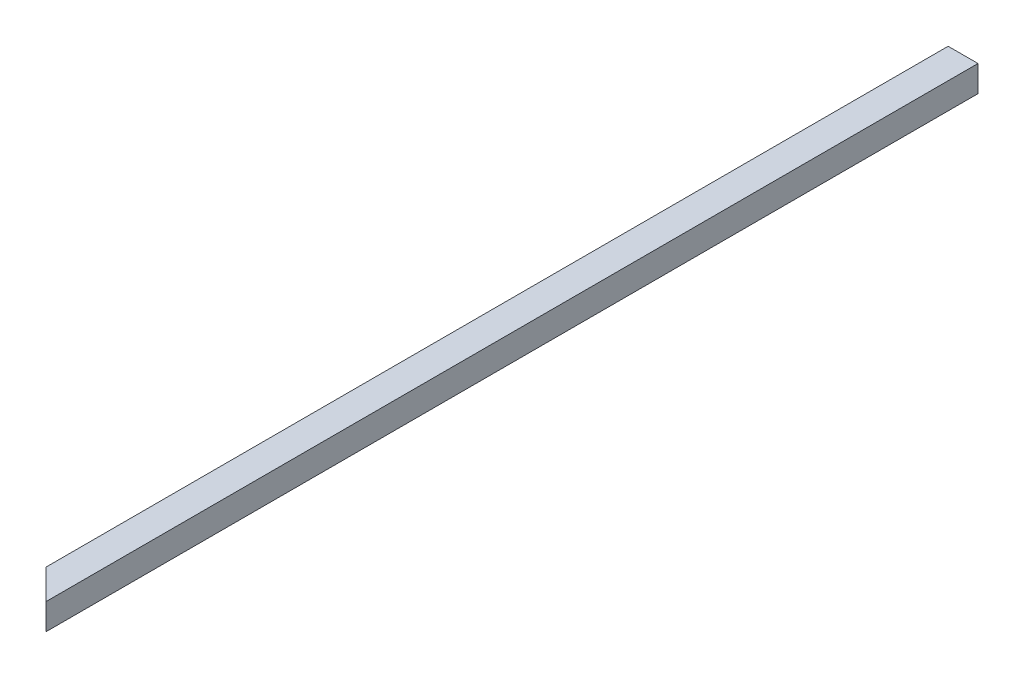
ISO-10303-21;
HEADER;
FILE_DESCRIPTION(('STEP AP214'),'2;1');
FILE_NAME('part.step','',(''),(''),'','','');
FILE_SCHEMA(('AUTOMOTIVE_DESIGN { 1 0 10303 214 1 1 1 1 }'));
ENDSEC;
DATA;
#1=APPLICATION_CONTEXT('core data for automotive mechanical design processes');
#2=APPLICATION_PROTOCOL_DEFINITION('international standard','automotive_design',2000,#1);
#3=PRODUCT_CONTEXT('',#1,'mechanical');
#4=PRODUCT('Part','Part','',(#3));
#5=PRODUCT_RELATED_PRODUCT_CATEGORY('part','',(#4));
#6=PRODUCT_DEFINITION_FORMATION('','',#4);
#7=PRODUCT_DEFINITION_CONTEXT('part definition',#1,'design');
#8=PRODUCT_DEFINITION('design','',#6,#7);
#9=PRODUCT_DEFINITION_SHAPE('','',#8);
#10=(LENGTH_UNIT() NAMED_UNIT(*) SI_UNIT(.MILLI.,.METRE.));
#11=(NAMED_UNIT(*) PLANE_ANGLE_UNIT() SI_UNIT($,.RADIAN.));
#12=(NAMED_UNIT(*) SI_UNIT($,.STERADIAN.) SOLID_ANGLE_UNIT());
#13=UNCERTAINTY_MEASURE_WITH_UNIT(LENGTH_MEASURE(1.E-05),#10,'distance_accuracy_value','');
#14=(GEOMETRIC_REPRESENTATION_CONTEXT(3) GLOBAL_UNCERTAINTY_ASSIGNED_CONTEXT((#13)) GLOBAL_UNIT_ASSIGNED_CONTEXT((#10,
#11,#12)) REPRESENTATION_CONTEXT('',''));
#15=CARTESIAN_POINT('',(0.,0.,0.));
#16=DIRECTION('',(0.,0.,1.));
#17=DIRECTION('',(1.,0.,0.));
#18=AXIS2_PLACEMENT_3D('',#15,#16,#17);
#19=CARTESIAN_POINT('',(83.9870704700034,0.,120.829699470003));
#20=DIRECTION('',(1.,0.,0.));
#21=DIRECTION('',(0.,0.,-1.));
#22=AXIS2_PLACEMENT_3D('',#19,#20,#21);
#23=PLANE('',#22);
#24=DIRECTION('',(0.,-1.,0.));
#25=VECTOR('',#24,1.);
#26=CARTESIAN_POINT('',(83.9870704700034,0.,0.));
#27=LINE('',#26,#25);
#28=CARTESIAN_POINT('',(83.9870704700034,0.,0.));
#29=VERTEX_POINT('',#28);
#30=CARTESIAN_POINT('',(83.9870704700034,-3.5,0.));
#31=VERTEX_POINT('',#30);
#32=EDGE_CURVE('E88',#29,#31,#27,.T.);
#33=ORIENTED_EDGE('',*,*,#32,.T.);
#34=DIRECTION('',(0.,0.,-1.));
#35=VECTOR('',#34,1.);
#36=CARTESIAN_POINT('',(83.9870704700034,-3.5,120.829699470003));
#37=LINE('',#36,#35);
#38=CARTESIAN_POINT('',(83.9870704700034,-3.5,120.829699470003));
#39=VERTEX_POINT('',#38);
#40=EDGE_CURVE('E11',#39,#31,#37,.T.);
#41=ORIENTED_EDGE('',*,*,#40,.F.);
#42=DIRECTION('',(0.,-1.,0.));
#43=VECTOR('',#42,1.);
#44=CARTESIAN_POINT('',(83.9870704700034,0.,120.829699470003));
#45=LINE('',#44,#43);
#46=CARTESIAN_POINT('',(83.9870704700034,0.,120.829699470003));
#47=VERTEX_POINT('',#46);
#48=EDGE_CURVE('E89',#47,#39,#45,.T.);
#49=ORIENTED_EDGE('',*,*,#48,.F.);
#50=DIRECTION('',(0.,0.,-1.));
#51=VECTOR('',#50,1.);
#52=CARTESIAN_POINT('',(83.9870704700034,0.,120.829699470003));
#53=LINE('',#52,#51);
#54=EDGE_CURVE('E84',#47,#29,#53,.T.);
#55=ORIENTED_EDGE('',*,*,#54,.T.);
#56=EDGE_LOOP('',(#33,#41,#49,#55));
#57=FACE_BOUND('',#56,.T.);
#58=ADVANCED_FACE('F32',(#57),#23,.F.);
#59=CARTESIAN_POINT('',(83.9870704700034,-3.5,120.829699470003));
#60=DIRECTION('',(0.,1.,0.));
#61=DIRECTION('',(0.,0.,1.));
#62=AXIS2_PLACEMENT_3D('',#59,#60,#61);
#63=PLANE('',#62);
#64=DIRECTION('',(1.,0.,0.));
#65=VECTOR('',#64,1.);
#66=CARTESIAN_POINT('',(83.9870704700034,-3.5,0.));
#67=LINE('',#66,#65);
#68=CARTESIAN_POINT('',(87.9870704700034,-3.5,0.));
#69=VERTEX_POINT('',#68);
#70=EDGE_CURVE('E75',#31,#69,#67,.T.);
#71=ORIENTED_EDGE('',*,*,#70,.T.);
#72=DIRECTION('',(0.,0.,-1.));
#73=VECTOR('',#72,1.);
#74=CARTESIAN_POINT('',(87.9870704700034,-3.5,120.829699470003));
#75=LINE('',#74,#73);
#76=CARTESIAN_POINT('',(87.9870704700033,-3.5,124.829699470003));
#77=VERTEX_POINT('',#76);
#78=EDGE_CURVE('E40',#77,#69,#75,.T.);
#79=ORIENTED_EDGE('',*,*,#78,.F.);
#80=DIRECTION('',(-0.707106781186545,0.,-0.70710678118655));
#81=VECTOR('',#80,1.);
#82=CARTESIAN_POINT('',(83.9870704700034,-3.5,120.829699470003));
#83=LINE('',#82,#81);
#84=EDGE_CURVE('E99',#77,#39,#83,.T.);
#85=ORIENTED_EDGE('',*,*,#84,.T.);
#86=ORIENTED_EDGE('',*,*,#40,.T.);
#87=EDGE_LOOP('',(#71,#79,#85,#86));
#88=FACE_BOUND('',#87,.T.);
#89=ADVANCED_FACE('F105',(#88),#63,.F.);
#90=CARTESIAN_POINT('',(87.9870704700034,0.,120.829699470003));
#91=DIRECTION('',(-1.,0.,0.));
#92=DIRECTION('',(0.,0.,1.));
#93=AXIS2_PLACEMENT_3D('',#90,#91,#92);
#94=PLANE('',#93);
#95=DIRECTION('',(0.,1.,0.));
#96=VECTOR('',#95,1.);
#97=CARTESIAN_POINT('',(87.9870704700034,0.,0.));
#98=LINE('',#97,#96);
#99=CARTESIAN_POINT('',(87.9870704700034,0.,0.));
#100=VERTEX_POINT('',#99);
#101=EDGE_CURVE('E64',#69,#100,#98,.T.);
#102=ORIENTED_EDGE('',*,*,#101,.T.);
#103=DIRECTION('',(0.,0.,-1.));
#104=VECTOR('',#103,1.);
#105=CARTESIAN_POINT('',(87.9870704700034,0.,120.829699470003));
#106=LINE('',#105,#104);
#107=CARTESIAN_POINT('',(87.9870704700033,0.,124.829699470003));
#108=VERTEX_POINT('',#107);
#109=EDGE_CURVE('E69',#108,#100,#106,.T.);
#110=ORIENTED_EDGE('',*,*,#109,.F.);
#111=DIRECTION('',(0.,-1.,0.));
#112=VECTOR('',#111,1.);
#113=CARTESIAN_POINT('',(87.9870704700033,0.,124.829699470003));
#114=LINE('',#113,#112);
#115=EDGE_CURVE('E98',#108,#77,#114,.T.);
#116=ORIENTED_EDGE('',*,*,#115,.T.);
#117=ORIENTED_EDGE('',*,*,#78,.T.);
#118=EDGE_LOOP('',(#102,#110,#116,#117));
#119=FACE_BOUND('',#118,.T.);
#120=ADVANCED_FACE('F66',(#119),#94,.F.);
#121=CARTESIAN_POINT('',(83.9870704700034,0.,120.829699470003));
#122=DIRECTION('',(0.,-1.,0.));
#123=DIRECTION('',(0.,0.,-1.));
#124=AXIS2_PLACEMENT_3D('',#121,#122,#123);
#125=PLANE('',#124);
#126=DIRECTION('',(-1.,0.,0.));
#127=VECTOR('',#126,1.);
#128=CARTESIAN_POINT('',(83.9870704700034,0.,0.));
#129=LINE('',#128,#127);
#130=EDGE_CURVE('E74',#100,#29,#129,.T.);
#131=ORIENTED_EDGE('',*,*,#130,.T.);
#132=ORIENTED_EDGE('',*,*,#54,.F.);
#133=DIRECTION('',(-0.707106781186545,0.,-0.70710678118655));
#134=VECTOR('',#133,1.);
#135=CARTESIAN_POINT('',(83.9870704700034,0.,120.829699470003));
#136=LINE('',#135,#134);
#137=EDGE_CURVE('E83',#108,#47,#136,.T.);
#138=ORIENTED_EDGE('',*,*,#137,.F.);
#139=ORIENTED_EDGE('',*,*,#109,.T.);
#140=EDGE_LOOP('',(#131,#132,#138,#139));
#141=FACE_BOUND('',#140,.T.);
#142=ADVANCED_FACE('F79',(#141),#125,.F.);
#143=CARTESIAN_POINT('',(0.,0.,0.));
#144=DIRECTION('',(0.,0.,1.));
#145=DIRECTION('',(1.,0.,0.));
#146=AXIS2_PLACEMENT_3D('',#143,#144,#145);
#147=PLANE('',#146);
#148=ORIENTED_EDGE('',*,*,#32,.F.);
#149=ORIENTED_EDGE('',*,*,#130,.F.);
#150=ORIENTED_EDGE('',*,*,#101,.F.);
#151=ORIENTED_EDGE('',*,*,#70,.F.);
#152=EDGE_LOOP('',(#148,#149,#150,#151));
#153=FACE_BOUND('',#152,.T.);
#154=ADVANCED_FACE('F87',(#153),#147,.F.);
#155=CARTESIAN_POINT('',(83.9870704700034,0.,120.829699470003));
#156=DIRECTION('',(-0.70710678118655,0.,0.707106781186545));
#157=DIRECTION('',(0.707106781186545,0.,0.70710678118655));
#158=AXIS2_PLACEMENT_3D('',#155,#156,#157);
#159=PLANE('',#158);
#160=ORIENTED_EDGE('',*,*,#84,.F.);
#161=ORIENTED_EDGE('',*,*,#115,.F.);
#162=ORIENTED_EDGE('',*,*,#137,.T.);
#163=ORIENTED_EDGE('',*,*,#48,.T.);
#164=EDGE_LOOP('',(#160,#161,#162,#163));
#165=FACE_BOUND('',#164,.T.);
#166=ADVANCED_FACE('F96',(#165),#159,.T.);
#167=CLOSED_SHELL('',(#58,#89,#120,#142,#154,#166));
#168=MANIFOLD_SOLID_BREP('B2',#167);
#169=ADVANCED_BREP_SHAPE_REPRESENTATION('',(#18,#168),#14);
#170=SHAPE_DEFINITION_REPRESENTATION(#9,#169);
ENDSEC;
END-ISO-10303-21;
